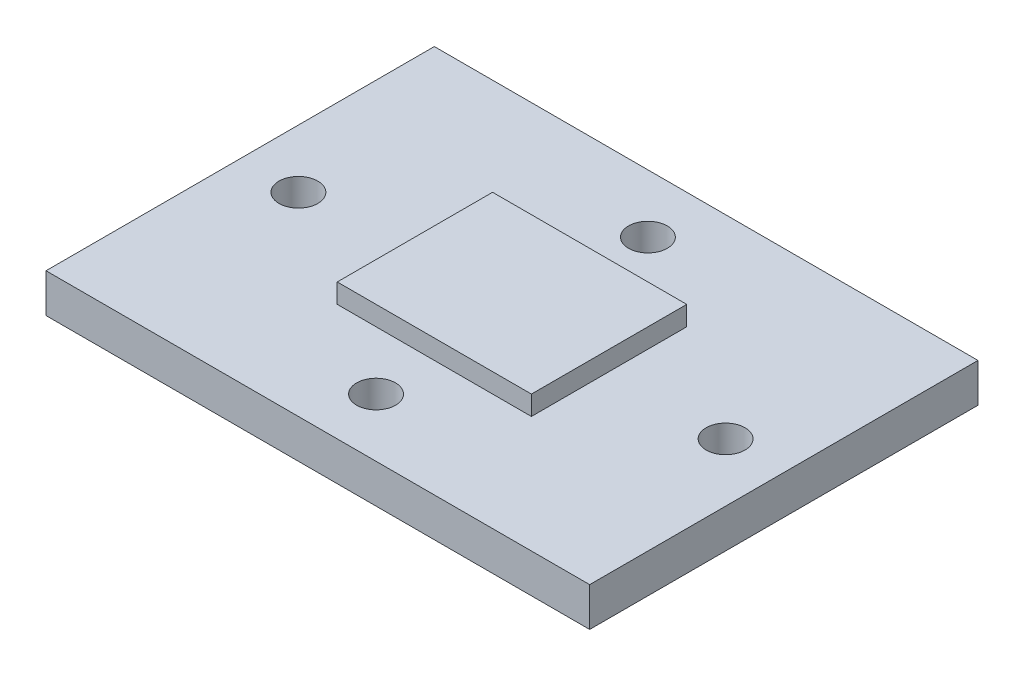
ISO-10303-21;
HEADER;
FILE_DESCRIPTION(('STEP AP214'),'2;1');
FILE_NAME('part.step','',(''),(''),'','','');
FILE_SCHEMA(('AUTOMOTIVE_DESIGN { 1 0 10303 214 1 1 1 1 }'));
ENDSEC;
DATA;
#1=APPLICATION_CONTEXT('core data for automotive mechanical design processes');
#2=APPLICATION_PROTOCOL_DEFINITION('international standard','automotive_design',2000,#1);
#3=PRODUCT_CONTEXT('',#1,'mechanical');
#4=PRODUCT('Part','Part','',(#3));
#5=PRODUCT_RELATED_PRODUCT_CATEGORY('part','',(#4));
#6=PRODUCT_DEFINITION_FORMATION('','',#4);
#7=PRODUCT_DEFINITION_CONTEXT('part definition',#1,'design');
#8=PRODUCT_DEFINITION('design','',#6,#7);
#9=PRODUCT_DEFINITION_SHAPE('','',#8);
#10=(LENGTH_UNIT() NAMED_UNIT(*) SI_UNIT(.MILLI.,.METRE.));
#11=(NAMED_UNIT(*) PLANE_ANGLE_UNIT() SI_UNIT($,.RADIAN.));
#12=(NAMED_UNIT(*) SI_UNIT($,.STERADIAN.) SOLID_ANGLE_UNIT());
#13=UNCERTAINTY_MEASURE_WITH_UNIT(LENGTH_MEASURE(1.E-05),#10,'distance_accuracy_value','');
#14=(GEOMETRIC_REPRESENTATION_CONTEXT(3) GLOBAL_UNCERTAINTY_ASSIGNED_CONTEXT((#13)) GLOBAL_UNIT_ASSIGNED_CONTEXT((#10,
#11,#12)) REPRESENTATION_CONTEXT('',''));
#15=CARTESIAN_POINT('',(0.,0.,0.));
#16=DIRECTION('',(0.,0.,1.));
#17=DIRECTION('',(1.,0.,0.));
#18=AXIS2_PLACEMENT_3D('',#15,#16,#17);
#19=CARTESIAN_POINT('',(0.,656.000000000002,0.));
#20=DIRECTION('',(0.,1.,0.));
#21=DIRECTION('',(0.,0.,1.));
#22=AXIS2_PLACEMENT_3D('',#19,#20,#21);
#23=PLANE('',#22);
#24=CARTESIAN_POINT('',(-510.539921299207,656.000000000002,-140.104414427725));
#25=DIRECTION('',(0.,1.,0.));
#26=DIRECTION('',(0.,0.,1.));
#27=AXIS2_PLACEMENT_3D('',#24,#25,#26);
#28=CIRCLE('',#27,5.00000000000005);
#29=CARTESIAN_POINT('',(-510.539921299207,656.000000000002,-135.104414427725));
#30=VERTEX_POINT('',#29);
#31=EDGE_CURVE('E149',#30,#30,#28,.T.);
#32=ORIENTED_EDGE('',*,*,#31,.F.);
#33=EDGE_LOOP('',(#32));
#34=FACE_BOUND('',#33,.T.);
#35=CARTESIAN_POINT('',(-565.539921299207,656.000000000002,-175.104414427725));
#36=DIRECTION('',(0.,1.,0.));
#37=DIRECTION('',(0.,0.,1.));
#38=AXIS2_PLACEMENT_3D('',#35,#36,#37);
#39=CIRCLE('',#38,5.00000000000005);
#40=CARTESIAN_POINT('',(-565.539921299207,656.000000000002,-170.104414427725));
#41=VERTEX_POINT('',#40);
#42=EDGE_CURVE('E161',#41,#41,#39,.T.);
#43=ORIENTED_EDGE('',*,*,#42,.F.);
#44=EDGE_LOOP('',(#43));
#45=FACE_BOUND('',#44,.T.);
#46=DIRECTION('',(0.,0.,1.));
#47=VECTOR('',#46,1.);
#48=CARTESIAN_POINT('',(-580.539921299207,656.000000000002,-225.104414427725));
#49=LINE('',#48,#47);
#50=CARTESIAN_POINT('',(-580.539921299207,656.000000000002,-225.104414427725));
#51=VERTEX_POINT('',#50);
#52=CARTESIAN_POINT('',(-580.539921299207,656.000000000002,-125.104414427725));
#53=VERTEX_POINT('',#52);
#54=EDGE_CURVE('E167',#51,#53,#49,.T.);
#55=ORIENTED_EDGE('',*,*,#54,.T.);
#56=DIRECTION('',(1.,0.,0.));
#57=VECTOR('',#56,1.);
#58=CARTESIAN_POINT('',(-580.539921299207,656.000000000002,-125.104414427725));
#59=LINE('',#58,#57);
#60=CARTESIAN_POINT('',(-440.539921299207,656.000000000002,-125.104414427725));
#61=VERTEX_POINT('',#60);
#62=EDGE_CURVE('E91',#53,#61,#59,.T.);
#63=ORIENTED_EDGE('',*,*,#62,.T.);
#64=DIRECTION('',(0.,0.,-1.));
#65=VECTOR('',#64,1.);
#66=CARTESIAN_POINT('',(-440.539921299207,656.000000000002,-225.104414427725));
#67=LINE('',#66,#65);
#68=CARTESIAN_POINT('',(-440.539921299207,656.000000000002,-225.104414427725));
#69=VERTEX_POINT('',#68);
#70=EDGE_CURVE('E170',#61,#69,#67,.T.);
#71=ORIENTED_EDGE('',*,*,#70,.T.);
#72=DIRECTION('',(-1.,0.,0.));
#73=VECTOR('',#72,1.);
#74=CARTESIAN_POINT('',(-580.539921299207,656.000000000002,-225.104414427725));
#75=LINE('',#74,#73);
#76=EDGE_CURVE('E63',#69,#51,#75,.T.);
#77=ORIENTED_EDGE('',*,*,#76,.T.);
#78=EDGE_LOOP('',(#55,#63,#71,#77));
#79=FACE_BOUND('',#78,.T.);
#80=CARTESIAN_POINT('',(-510.539921299207,656.000000000002,-210.104414427725));
#81=DIRECTION('',(0.,1.,0.));
#82=DIRECTION('',(0.,0.,1.));
#83=AXIS2_PLACEMENT_3D('',#80,#81,#82);
#84=CIRCLE('',#83,5.00000000000005);
#85=CARTESIAN_POINT('',(-510.539921299207,656.000000000002,-205.104414427725));
#86=VERTEX_POINT('',#85);
#87=EDGE_CURVE('E155',#86,#86,#84,.T.);
#88=ORIENTED_EDGE('',*,*,#87,.F.);
#89=EDGE_LOOP('',(#88));
#90=FACE_BOUND('',#89,.T.);
#91=CARTESIAN_POINT('',(-455.539921299207,656.000000000002,-175.104414427725));
#92=DIRECTION('',(0.,1.,0.));
#93=DIRECTION('',(0.,0.,1.));
#94=AXIS2_PLACEMENT_3D('',#91,#92,#93);
#95=CIRCLE('',#94,4.99999999999999);
#96=CARTESIAN_POINT('',(-455.539921299207,656.000000000002,-170.104414427725));
#97=VERTEX_POINT('',#96);
#98=EDGE_CURVE('E141',#97,#97,#95,.T.);
#99=ORIENTED_EDGE('',*,*,#98,.F.);
#100=EDGE_LOOP('',(#99));
#101=FACE_BOUND('',#100,.T.);
#102=DIRECTION('',(1.,0.,0.));
#103=VECTOR('',#102,1.);
#104=CARTESIAN_POINT('',(-535.539921299207,656.000000000002,-155.104414427725));
#105=LINE('',#104,#103);
#106=CARTESIAN_POINT('',(-535.539921299207,656.000000000002,-155.104414427725));
#107=VERTEX_POINT('',#106);
#108=CARTESIAN_POINT('',(-485.539921299207,656.000000000002,-155.104414427725));
#109=VERTEX_POINT('',#108);
#110=EDGE_CURVE('E367',#107,#109,#105,.T.);
#111=ORIENTED_EDGE('',*,*,#110,.F.);
#112=DIRECTION('',(0.,0.,1.));
#113=VECTOR('',#112,1.);
#114=CARTESIAN_POINT('',(-535.539921299207,656.000000000002,-195.104414427725));
#115=LINE('',#114,#113);
#116=CARTESIAN_POINT('',(-535.539921299207,656.000000000002,-195.104414427725));
#117=VERTEX_POINT('',#116);
#118=EDGE_CURVE('E136',#117,#107,#115,.T.);
#119=ORIENTED_EDGE('',*,*,#118,.F.);
#120=DIRECTION('',(-1.,0.,0.));
#121=VECTOR('',#120,1.);
#122=CARTESIAN_POINT('',(-535.539921299207,656.000000000002,-195.104414427725));
#123=LINE('',#122,#121);
#124=CARTESIAN_POINT('',(-485.539921299207,656.000000000002,-195.104414427725));
#125=VERTEX_POINT('',#124);
#126=EDGE_CURVE('E132',#125,#117,#123,.T.);
#127=ORIENTED_EDGE('',*,*,#126,.F.);
#128=DIRECTION('',(0.,0.,-1.));
#129=VECTOR('',#128,1.);
#130=CARTESIAN_POINT('',(-485.539921299207,656.000000000002,-195.104414427725));
#131=LINE('',#130,#129);
#132=EDGE_CURVE('E364',#109,#125,#131,.T.);
#133=ORIENTED_EDGE('',*,*,#132,.F.);
#134=EDGE_LOOP('',(#111,#119,#127,#133));
#135=FACE_BOUND('',#134,.T.);
#136=ADVANCED_FACE('F39',(#34,#45,#79,#90,#101,#135),#23,.T.);
#137=CARTESIAN_POINT('',(0.,646.000000000002,0.));
#138=DIRECTION('',(0.,1.,0.));
#139=DIRECTION('',(0.,0.,1.));
#140=AXIS2_PLACEMENT_3D('',#137,#138,#139);
#141=PLANE('',#140);
#142=DIRECTION('',(0.,0.,1.));
#143=VECTOR('',#142,1.);
#144=CARTESIAN_POINT('',(-580.539921299207,646.000000000002,-225.104414427725));
#145=LINE('',#144,#143);
#146=CARTESIAN_POINT('',(-580.539921299207,646.000000000002,-225.104414427725));
#147=VERTEX_POINT('',#146);
#148=CARTESIAN_POINT('',(-580.539921299207,646.000000000002,-125.104414427725));
#149=VERTEX_POINT('',#148);
#150=EDGE_CURVE('E164',#147,#149,#145,.T.);
#151=ORIENTED_EDGE('',*,*,#150,.F.);
#152=DIRECTION('',(-1.,0.,0.));
#153=VECTOR('',#152,1.);
#154=CARTESIAN_POINT('',(-580.539921299207,646.000000000002,-225.104414427725));
#155=LINE('',#154,#153);
#156=CARTESIAN_POINT('',(-440.539921299207,646.000000000002,-225.104414427725));
#157=VERTEX_POINT('',#156);
#158=EDGE_CURVE('E84',#157,#147,#155,.T.);
#159=ORIENTED_EDGE('',*,*,#158,.F.);
#160=DIRECTION('',(0.,0.,-1.));
#161=VECTOR('',#160,1.);
#162=CARTESIAN_POINT('',(-440.539921299207,646.000000000002,-225.104414427725));
#163=LINE('',#162,#161);
#164=CARTESIAN_POINT('',(-440.539921299207,646.000000000002,-125.104414427725));
#165=VERTEX_POINT('',#164);
#166=EDGE_CURVE('E178',#165,#157,#163,.T.);
#167=ORIENTED_EDGE('',*,*,#166,.F.);
#168=DIRECTION('',(1.,0.,0.));
#169=VECTOR('',#168,1.);
#170=CARTESIAN_POINT('',(-580.539921299207,646.000000000002,-125.104414427725));
#171=LINE('',#170,#169);
#172=EDGE_CURVE('E176',#149,#165,#171,.T.);
#173=ORIENTED_EDGE('',*,*,#172,.F.);
#174=EDGE_LOOP('',(#151,#159,#167,#173));
#175=FACE_BOUND('',#174,.T.);
#176=CARTESIAN_POINT('',(-565.539921299207,646.000000000002,-175.104414427725));
#177=DIRECTION('',(0.,1.,0.));
#178=DIRECTION('',(0.,0.,1.));
#179=AXIS2_PLACEMENT_3D('',#176,#177,#178);
#180=CIRCLE('',#179,5.00000000000005);
#181=CARTESIAN_POINT('',(-565.539921299207,646.000000000002,-170.104414427725));
#182=VERTEX_POINT('',#181);
#183=EDGE_CURVE('E158',#182,#182,#180,.T.);
#184=ORIENTED_EDGE('',*,*,#183,.T.);
#185=EDGE_LOOP('',(#184));
#186=FACE_BOUND('',#185,.T.);
#187=CARTESIAN_POINT('',(-510.539921299207,646.000000000002,-210.104414427725));
#188=DIRECTION('',(0.,1.,0.));
#189=DIRECTION('',(0.,0.,1.));
#190=AXIS2_PLACEMENT_3D('',#187,#188,#189);
#191=CIRCLE('',#190,5.00000000000005);
#192=CARTESIAN_POINT('',(-510.539921299207,646.000000000002,-205.104414427725));
#193=VERTEX_POINT('',#192);
#194=EDGE_CURVE('E152',#193,#193,#191,.T.);
#195=ORIENTED_EDGE('',*,*,#194,.T.);
#196=EDGE_LOOP('',(#195));
#197=FACE_BOUND('',#196,.T.);
#198=CARTESIAN_POINT('',(-510.539921299207,646.000000000002,-140.104414427725));
#199=DIRECTION('',(0.,1.,0.));
#200=DIRECTION('',(0.,0.,1.));
#201=AXIS2_PLACEMENT_3D('',#198,#199,#200);
#202=CIRCLE('',#201,5.00000000000005);
#203=CARTESIAN_POINT('',(-510.539921299207,646.000000000002,-135.104414427725));
#204=VERTEX_POINT('',#203);
#205=EDGE_CURVE('E147',#204,#204,#202,.T.);
#206=ORIENTED_EDGE('',*,*,#205,.T.);
#207=EDGE_LOOP('',(#206));
#208=FACE_BOUND('',#207,.T.);
#209=CARTESIAN_POINT('',(-455.539921299207,646.000000000002,-175.104414427725));
#210=DIRECTION('',(0.,1.,0.));
#211=DIRECTION('',(0.,0.,1.));
#212=AXIS2_PLACEMENT_3D('',#209,#210,#211);
#213=CIRCLE('',#212,4.99999999999999);
#214=CARTESIAN_POINT('',(-455.539921299207,646.000000000002,-170.104414427725));
#215=VERTEX_POINT('',#214);
#216=EDGE_CURVE('E138',#215,#215,#213,.T.);
#217=ORIENTED_EDGE('',*,*,#216,.T.);
#218=EDGE_LOOP('',(#217));
#219=FACE_BOUND('',#218,.T.);
#220=ADVANCED_FACE('F191',(#175,#186,#197,#208,#219),#141,.F.);
#221=CARTESIAN_POINT('',(-580.539921299207,656.000000000002,-225.104414427725));
#222=DIRECTION('',(1.,0.,0.));
#223=DIRECTION('',(0.,0.,-1.));
#224=AXIS2_PLACEMENT_3D('',#221,#222,#223);
#225=PLANE('',#224);
#226=ORIENTED_EDGE('',*,*,#150,.T.);
#227=DIRECTION('',(0.,-1.,0.));
#228=VECTOR('',#227,1.);
#229=CARTESIAN_POINT('',(-580.539921299207,656.000000000002,-125.104414427725));
#230=LINE('',#229,#228);
#231=EDGE_CURVE('E11',#53,#149,#230,.T.);
#232=ORIENTED_EDGE('',*,*,#231,.F.);
#233=ORIENTED_EDGE('',*,*,#54,.F.);
#234=DIRECTION('',(0.,-1.,0.));
#235=VECTOR('',#234,1.);
#236=CARTESIAN_POINT('',(-580.539921299207,656.000000000002,-225.104414427725));
#237=LINE('',#236,#235);
#238=EDGE_CURVE('E173',#51,#147,#237,.T.);
#239=ORIENTED_EDGE('',*,*,#238,.T.);
#240=EDGE_LOOP('',(#226,#232,#233,#239));
#241=FACE_BOUND('',#240,.T.);
#242=ADVANCED_FACE('F41',(#241),#225,.F.);
#243=CARTESIAN_POINT('',(-580.539921299207,656.000000000002,-125.104414427725));
#244=DIRECTION('',(0.,0.,-1.));
#245=DIRECTION('',(-1.,0.,0.));
#246=AXIS2_PLACEMENT_3D('',#243,#244,#245);
#247=PLANE('',#246);
#248=ORIENTED_EDGE('',*,*,#172,.T.);
#249=DIRECTION('',(0.,-1.,0.));
#250=VECTOR('',#249,1.);
#251=CARTESIAN_POINT('',(-440.539921299207,656.000000000002,-125.104414427725));
#252=LINE('',#251,#250);
#253=EDGE_CURVE('E47',#61,#165,#252,.T.);
#254=ORIENTED_EDGE('',*,*,#253,.F.);
#255=ORIENTED_EDGE('',*,*,#62,.F.);
#256=ORIENTED_EDGE('',*,*,#231,.T.);
#257=EDGE_LOOP('',(#248,#254,#255,#256));
#258=FACE_BOUND('',#257,.T.);
#259=ADVANCED_FACE('F207',(#258),#247,.F.);
#260=CARTESIAN_POINT('',(-440.539921299207,656.000000000002,-225.104414427725));
#261=DIRECTION('',(-1.,0.,0.));
#262=DIRECTION('',(0.,0.,1.));
#263=AXIS2_PLACEMENT_3D('',#260,#261,#262);
#264=PLANE('',#263);
#265=ORIENTED_EDGE('',*,*,#166,.T.);
#266=DIRECTION('',(0.,-1.,0.));
#267=VECTOR('',#266,1.);
#268=CARTESIAN_POINT('',(-440.539921299207,656.000000000002,-225.104414427725));
#269=LINE('',#268,#267);
#270=EDGE_CURVE('E182',#69,#157,#269,.T.);
#271=ORIENTED_EDGE('',*,*,#270,.F.);
#272=ORIENTED_EDGE('',*,*,#70,.F.);
#273=ORIENTED_EDGE('',*,*,#253,.T.);
#274=EDGE_LOOP('',(#265,#271,#272,#273));
#275=FACE_BOUND('',#274,.T.);
#276=ADVANCED_FACE('F187',(#275),#264,.F.);
#277=CARTESIAN_POINT('',(-580.539921299207,656.000000000002,-225.104414427725));
#278=DIRECTION('',(0.,0.,1.));
#279=DIRECTION('',(1.,0.,0.));
#280=AXIS2_PLACEMENT_3D('',#277,#278,#279);
#281=PLANE('',#280);
#282=ORIENTED_EDGE('',*,*,#158,.T.);
#283=ORIENTED_EDGE('',*,*,#238,.F.);
#284=ORIENTED_EDGE('',*,*,#76,.F.);
#285=ORIENTED_EDGE('',*,*,#270,.T.);
#286=EDGE_LOOP('',(#282,#283,#284,#285));
#287=FACE_BOUND('',#286,.T.);
#288=ADVANCED_FACE('F196',(#287),#281,.F.);
#289=CARTESIAN_POINT('',(-565.539921299207,656.000000000002,-175.104414427725));
#290=DIRECTION('',(0.,-1.,0.));
#291=DIRECTION('',(0.,0.,-1.));
#292=AXIS2_PLACEMENT_3D('',#289,#290,#291);
#293=CYLINDRICAL_SURFACE('',#292,5.00000000000005);
#294=ORIENTED_EDGE('',*,*,#42,.T.);
#295=EDGE_LOOP('',(#294));
#296=FACE_BOUND('',#295,.T.);
#297=ORIENTED_EDGE('',*,*,#183,.F.);
#298=EDGE_LOOP('',(#297));
#299=FACE_BOUND('',#298,.T.);
#300=ADVANCED_FACE('F198',(#296,#299),#293,.F.);
#301=CARTESIAN_POINT('',(-510.539921299207,656.000000000002,-210.104414427725));
#302=DIRECTION('',(0.,-1.,0.));
#303=DIRECTION('',(0.,0.,-1.));
#304=AXIS2_PLACEMENT_3D('',#301,#302,#303);
#305=CYLINDRICAL_SURFACE('',#304,5.00000000000005);
#306=ORIENTED_EDGE('',*,*,#87,.T.);
#307=EDGE_LOOP('',(#306));
#308=FACE_BOUND('',#307,.T.);
#309=ORIENTED_EDGE('',*,*,#194,.F.);
#310=EDGE_LOOP('',(#309));
#311=FACE_BOUND('',#310,.T.);
#312=ADVANCED_FACE('F204',(#308,#311),#305,.F.);
#313=CARTESIAN_POINT('',(-510.539921299207,656.000000000002,-140.104414427725));
#314=DIRECTION('',(0.,-1.,0.));
#315=DIRECTION('',(0.,0.,-1.));
#316=AXIS2_PLACEMENT_3D('',#313,#314,#315);
#317=CYLINDRICAL_SURFACE('',#316,5.00000000000005);
#318=ORIENTED_EDGE('',*,*,#31,.T.);
#319=EDGE_LOOP('',(#318));
#320=FACE_BOUND('',#319,.T.);
#321=ORIENTED_EDGE('',*,*,#205,.F.);
#322=EDGE_LOOP('',(#321));
#323=FACE_BOUND('',#322,.T.);
#324=ADVANCED_FACE('F221',(#320,#323),#317,.F.);
#325=CARTESIAN_POINT('',(-455.539921299207,656.000000000002,-175.104414427725));
#326=DIRECTION('',(0.,-1.,0.));
#327=DIRECTION('',(0.,0.,-1.));
#328=AXIS2_PLACEMENT_3D('',#325,#326,#327);
#329=CYLINDRICAL_SURFACE('',#328,4.99999999999999);
#330=ORIENTED_EDGE('',*,*,#98,.T.);
#331=EDGE_LOOP('',(#330));
#332=FACE_BOUND('',#331,.T.);
#333=ORIENTED_EDGE('',*,*,#216,.F.);
#334=EDGE_LOOP('',(#333));
#335=FACE_BOUND('',#334,.T.);
#336=ADVANCED_FACE('F225',(#332,#335),#329,.F.);
#337=CARTESIAN_POINT('',(-535.539921299207,661.000000000002,-195.104414427725));
#338=DIRECTION('',(1.,0.,0.));
#339=DIRECTION('',(0.,0.,-1.));
#340=AXIS2_PLACEMENT_3D('',#337,#338,#339);
#341=PLANE('',#340);
#342=ORIENTED_EDGE('',*,*,#118,.T.);
#343=DIRECTION('',(0.,-1.,0.));
#344=VECTOR('',#343,1.);
#345=CARTESIAN_POINT('',(-535.539921299207,661.000000000002,-155.104414427725));
#346=LINE('',#345,#344);
#347=CARTESIAN_POINT('',(-535.539921299207,661.000000000002,-155.104414427725));
#348=VERTEX_POINT('',#347);
#349=EDGE_CURVE('E117',#348,#107,#346,.T.);
#350=ORIENTED_EDGE('',*,*,#349,.F.);
#351=DIRECTION('',(0.,0.,1.));
#352=VECTOR('',#351,1.);
#353=CARTESIAN_POINT('',(-535.539921299207,661.000000000002,-195.104414427725));
#354=LINE('',#353,#352);
#355=CARTESIAN_POINT('',(-535.539921299207,661.000000000002,-195.104414427725));
#356=VERTEX_POINT('',#355);
#357=EDGE_CURVE('E124',#356,#348,#354,.T.);
#358=ORIENTED_EDGE('',*,*,#357,.F.);
#359=DIRECTION('',(0.,-1.,0.));
#360=VECTOR('',#359,1.);
#361=CARTESIAN_POINT('',(-535.539921299207,661.000000000002,-195.104414427725));
#362=LINE('',#361,#360);
#363=EDGE_CURVE('E361',#356,#117,#362,.T.);
#364=ORIENTED_EDGE('',*,*,#363,.T.);
#365=EDGE_LOOP('',(#342,#350,#358,#364));
#366=FACE_BOUND('',#365,.T.);
#367=ADVANCED_FACE('F134',(#366),#341,.F.);
#368=CARTESIAN_POINT('',(-535.539921299207,661.000000000002,-155.104414427725));
#369=DIRECTION('',(0.,0.,-1.));
#370=DIRECTION('',(-1.,0.,0.));
#371=AXIS2_PLACEMENT_3D('',#368,#369,#370);
#372=PLANE('',#371);
#373=ORIENTED_EDGE('',*,*,#110,.T.);
#374=DIRECTION('',(0.,-1.,0.));
#375=VECTOR('',#374,1.);
#376=CARTESIAN_POINT('',(-485.539921299207,661.000000000002,-155.104414427725));
#377=LINE('',#376,#375);
#378=CARTESIAN_POINT('',(-485.539921299207,661.000000000002,-155.104414427725));
#379=VERTEX_POINT('',#378);
#380=EDGE_CURVE('E120',#379,#109,#377,.T.);
#381=ORIENTED_EDGE('',*,*,#380,.F.);
#382=DIRECTION('',(1.,0.,0.));
#383=VECTOR('',#382,1.);
#384=CARTESIAN_POINT('',(-535.539921299207,661.000000000002,-155.104414427725));
#385=LINE('',#384,#383);
#386=EDGE_CURVE('E113',#348,#379,#385,.T.);
#387=ORIENTED_EDGE('',*,*,#386,.F.);
#388=ORIENTED_EDGE('',*,*,#349,.T.);
#389=EDGE_LOOP('',(#373,#381,#387,#388));
#390=FACE_BOUND('',#389,.T.);
#391=ADVANCED_FACE('F115',(#390),#372,.F.);
#392=CARTESIAN_POINT('',(-485.539921299207,661.000000000002,-195.104414427725));
#393=DIRECTION('',(-1.,0.,0.));
#394=DIRECTION('',(0.,0.,1.));
#395=AXIS2_PLACEMENT_3D('',#392,#393,#394);
#396=PLANE('',#395);
#397=ORIENTED_EDGE('',*,*,#132,.T.);
#398=DIRECTION('',(0.,-1.,0.));
#399=VECTOR('',#398,1.);
#400=CARTESIAN_POINT('',(-485.539921299207,661.000000000002,-195.104414427725));
#401=LINE('',#400,#399);
#402=CARTESIAN_POINT('',(-485.539921299207,661.000000000002,-195.104414427725));
#403=VERTEX_POINT('',#402);
#404=EDGE_CURVE('E54',#403,#125,#401,.T.);
#405=ORIENTED_EDGE('',*,*,#404,.F.);
#406=DIRECTION('',(0.,0.,-1.));
#407=VECTOR('',#406,1.);
#408=CARTESIAN_POINT('',(-485.539921299207,661.000000000002,-195.104414427725));
#409=LINE('',#408,#407);
#410=EDGE_CURVE('E123',#379,#403,#409,.T.);
#411=ORIENTED_EDGE('',*,*,#410,.F.);
#412=ORIENTED_EDGE('',*,*,#380,.T.);
#413=EDGE_LOOP('',(#397,#405,#411,#412));
#414=FACE_BOUND('',#413,.T.);
#415=ADVANCED_FACE('F234',(#414),#396,.F.);
#416=CARTESIAN_POINT('',(-535.539921299207,661.000000000002,-195.104414427725));
#417=DIRECTION('',(0.,0.,1.));
#418=DIRECTION('',(1.,0.,0.));
#419=AXIS2_PLACEMENT_3D('',#416,#417,#418);
#420=PLANE('',#419);
#421=ORIENTED_EDGE('',*,*,#126,.T.);
#422=ORIENTED_EDGE('',*,*,#363,.F.);
#423=DIRECTION('',(-1.,0.,0.));
#424=VECTOR('',#423,1.);
#425=CARTESIAN_POINT('',(-535.539921299207,661.000000000002,-195.104414427725));
#426=LINE('',#425,#424);
#427=EDGE_CURVE('E128',#403,#356,#426,.T.);
#428=ORIENTED_EDGE('',*,*,#427,.F.);
#429=ORIENTED_EDGE('',*,*,#404,.T.);
#430=EDGE_LOOP('',(#421,#422,#428,#429));
#431=FACE_BOUND('',#430,.T.);
#432=ADVANCED_FACE('F237',(#431),#420,.F.);
#433=CARTESIAN_POINT('',(0.,661.000000000002,0.));
#434=DIRECTION('',(0.,1.,0.));
#435=DIRECTION('',(0.,0.,1.));
#436=AXIS2_PLACEMENT_3D('',#433,#434,#435);
#437=PLANE('',#436);
#438=ORIENTED_EDGE('',*,*,#357,.T.);
#439=ORIENTED_EDGE('',*,*,#386,.T.);
#440=ORIENTED_EDGE('',*,*,#410,.T.);
#441=ORIENTED_EDGE('',*,*,#427,.T.);
#442=EDGE_LOOP('',(#438,#439,#440,#441));
#443=FACE_BOUND('',#442,.T.);
#444=ADVANCED_FACE('F127',(#443),#437,.T.);
#445=CLOSED_SHELL('',(#136,#220,#242,#259,#276,#288,#300,#312,#324,#336,#367,#391,#415,#432,#444));
#446=MANIFOLD_SOLID_BREP('B2',#445);
#447=ADVANCED_BREP_SHAPE_REPRESENTATION('',(#18,#446),#14);
#448=SHAPE_DEFINITION_REPRESENTATION(#9,#447);
ENDSEC;
END-ISO-10303-21;
